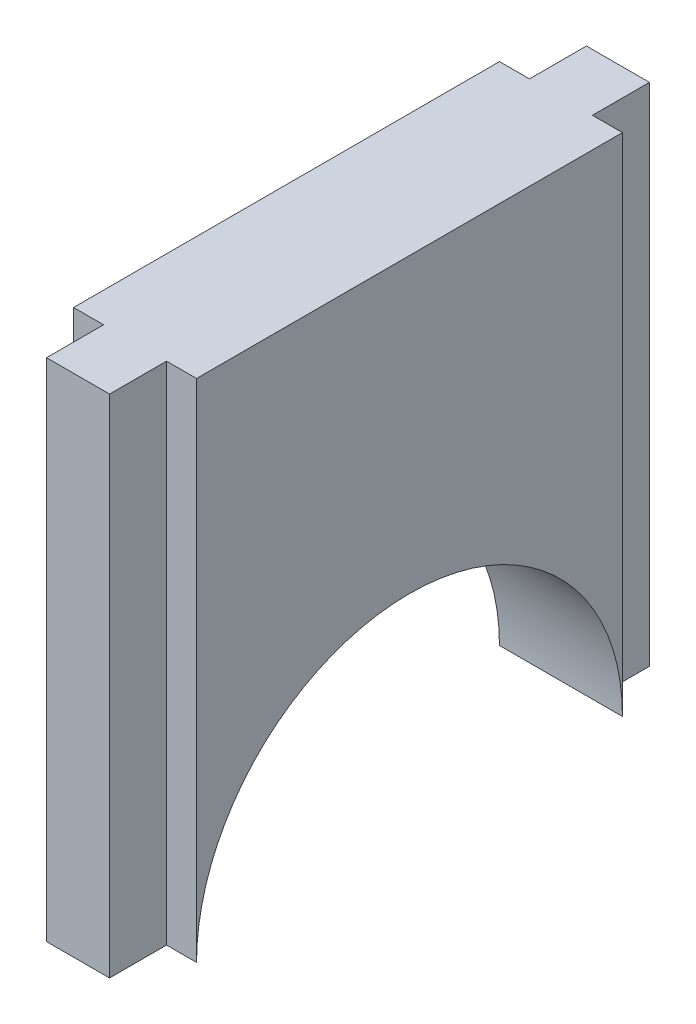
ISO-10303-21;
HEADER;
FILE_DESCRIPTION(('STEP AP214'),'2;1');
FILE_NAME('part.step','',(''),(''),'','','');
FILE_SCHEMA(('AUTOMOTIVE_DESIGN { 1 0 10303 214 1 1 1 1 }'));
ENDSEC;
DATA;
#1=APPLICATION_CONTEXT('core data for automotive mechanical design processes');
#2=APPLICATION_PROTOCOL_DEFINITION('international standard','automotive_design',2000,#1);
#3=PRODUCT_CONTEXT('',#1,'mechanical');
#4=PRODUCT('Part','Part','',(#3));
#5=PRODUCT_RELATED_PRODUCT_CATEGORY('part','',(#4));
#6=PRODUCT_DEFINITION_FORMATION('','',#4);
#7=PRODUCT_DEFINITION_CONTEXT('part definition',#1,'design');
#8=PRODUCT_DEFINITION('design','',#6,#7);
#9=PRODUCT_DEFINITION_SHAPE('','',#8);
#10=(LENGTH_UNIT() NAMED_UNIT(*) SI_UNIT(.MILLI.,.METRE.));
#11=(NAMED_UNIT(*) PLANE_ANGLE_UNIT() SI_UNIT($,.RADIAN.));
#12=(NAMED_UNIT(*) SI_UNIT($,.STERADIAN.) SOLID_ANGLE_UNIT());
#13=UNCERTAINTY_MEASURE_WITH_UNIT(LENGTH_MEASURE(1.E-05),#10,'distance_accuracy_value','');
#14=(GEOMETRIC_REPRESENTATION_CONTEXT(3) GLOBAL_UNCERTAINTY_ASSIGNED_CONTEXT((#13)) GLOBAL_UNIT_ASSIGNED_CONTEXT((#10,
#11,#12)) REPRESENTATION_CONTEXT('',''));
#15=CARTESIAN_POINT('',(0.,0.,0.));
#16=DIRECTION('',(0.,0.,1.));
#17=DIRECTION('',(1.,0.,0.));
#18=AXIS2_PLACEMENT_3D('',#15,#16,#17);
#19=CARTESIAN_POINT('',(-28.65,-16.8599999999996,-19.5999999999987));
#20=DIRECTION('',(0.,0.,1.));
#21=DIRECTION('',(1.,0.,0.));
#22=AXIS2_PLACEMENT_3D('',#19,#20,#21);
#23=PLANE('',#22);
#24=DIRECTION('',(-1.,0.,0.));
#25=VECTOR('',#24,1.);
#26=CARTESIAN_POINT('',(-28.65,0.,-19.5999999999987));
#27=LINE('',#26,#25);
#28=CARTESIAN_POINT('',(-31.75,0.,-19.5999999999987));
#29=VERTEX_POINT('',#28);
#30=CARTESIAN_POINT('',(-32.75,0.,-19.5999999999987));
#31=VERTEX_POINT('',#30);
#32=EDGE_CURVE('E197',#29,#31,#27,.T.);
#33=ORIENTED_EDGE('',*,*,#32,.F.);
#34=DIRECTION('',(0.,1.,0.));
#35=VECTOR('',#34,1.);
#36=CARTESIAN_POINT('',(-31.75,-16.8599999999996,-19.5999999999987));
#37=LINE('',#36,#35);
#38=CARTESIAN_POINT('',(-31.75,-16.8599999999996,-19.5999999999987));
#39=VERTEX_POINT('',#38);
#40=EDGE_CURVE('E187',#39,#29,#37,.T.);
#41=ORIENTED_EDGE('',*,*,#40,.F.);
#42=DIRECTION('',(-1.,0.,0.));
#43=VECTOR('',#42,1.);
#44=CARTESIAN_POINT('',(-28.65,-16.8599999999996,-19.5999999999987));
#45=LINE('',#44,#43);
#46=CARTESIAN_POINT('',(-32.75,-16.8599999999996,-19.5999999999987));
#47=VERTEX_POINT('',#46);
#48=EDGE_CURVE('E195',#39,#47,#45,.T.);
#49=ORIENTED_EDGE('',*,*,#48,.T.);
#50=DIRECTION('',(0.,1.,0.));
#51=VECTOR('',#50,1.);
#52=CARTESIAN_POINT('',(-32.75,-16.8599999999996,-19.5999999999987));
#53=LINE('',#52,#51);
#54=EDGE_CURVE('E208',#47,#31,#53,.T.);
#55=ORIENTED_EDGE('',*,*,#54,.T.);
#56=EDGE_LOOP('',(#33,#41,#49,#55));
#57=FACE_BOUND('',#56,.T.);
#58=ADVANCED_FACE('F78',(#57),#23,.F.);
#59=CARTESIAN_POINT('',(-28.65,0.,-5.39999999999866));
#60=DIRECTION('',(0.,0.,-1.));
#61=DIRECTION('',(0.,1.,0.));
#62=AXIS2_PLACEMENT_3D('',#59,#60,#61);
#63=PLANE('',#62);
#64=DIRECTION('',(-1.,0.,0.));
#65=VECTOR('',#64,1.);
#66=CARTESIAN_POINT('',(-28.65,-16.8599999999996,-5.39999999999866));
#67=LINE('',#66,#65);
#68=CARTESIAN_POINT('',(-31.75,-16.8599999999996,-5.39999999999866));
#69=VERTEX_POINT('',#68);
#70=CARTESIAN_POINT('',(-32.75,-16.8599999999996,-5.39999999999866));
#71=VERTEX_POINT('',#70);
#72=EDGE_CURVE('E228',#69,#71,#67,.T.);
#73=ORIENTED_EDGE('',*,*,#72,.F.);
#74=DIRECTION('',(0.,1.,0.));
#75=VECTOR('',#74,1.);
#76=CARTESIAN_POINT('',(-31.75,-16.8599999999996,-5.39999999999866));
#77=LINE('',#76,#75);
#78=CARTESIAN_POINT('',(-31.75,0.,-5.39999999999866));
#79=VERTEX_POINT('',#78);
#80=EDGE_CURVE('E284',#69,#79,#77,.T.);
#81=ORIENTED_EDGE('',*,*,#80,.T.);
#82=DIRECTION('',(-1.,0.,0.));
#83=VECTOR('',#82,1.);
#84=CARTESIAN_POINT('',(-28.65,0.,-5.39999999999866));
#85=LINE('',#84,#83);
#86=CARTESIAN_POINT('',(-32.75,0.,-5.39999999999866));
#87=VERTEX_POINT('',#86);
#88=EDGE_CURVE('E88',#79,#87,#85,.T.);
#89=ORIENTED_EDGE('',*,*,#88,.T.);
#90=DIRECTION('',(0.,-1.,0.));
#91=VECTOR('',#90,1.);
#92=CARTESIAN_POINT('',(-32.75,0.,-5.39999999999866));
#93=LINE('',#92,#91);
#94=EDGE_CURVE('E213',#87,#71,#93,.T.);
#95=ORIENTED_EDGE('',*,*,#94,.T.);
#96=EDGE_LOOP('',(#73,#81,#89,#95));
#97=FACE_BOUND('',#96,.T.);
#98=ADVANCED_FACE('F346',(#97),#63,.F.);
#99=CARTESIAN_POINT('',(-30.950012,-16.8599999999996,-12.4999999999987));
#100=DIRECTION('',(1.,0.,0.));
#101=DIRECTION('',(0.,0.,-1.));
#102=AXIS2_PLACEMENT_3D('',#99,#100,#101);
#103=CYLINDRICAL_SURFACE('',#102,7.1);
#104=CARTESIAN_POINT('',(-28.65,-16.8599999999996,-5.39999999999866));
#105=VERTEX_POINT('',#104);
#106=CARTESIAN_POINT('',(-29.65,-16.8599999999996,-5.39999999999866));
#107=VERTEX_POINT('',#106);
#108=EDGE_CURVE('E224',#105,#107,#67,.T.);
#109=ORIENTED_EDGE('',*,*,#108,.T.);
#110=DIRECTION('',(-1.,0.,0.));
#111=VECTOR('',#110,1.);
#112=CARTESIAN_POINT('',(-31.75,-16.8599999999996,-5.39999999999866));
#113=LINE('',#112,#111);
#114=EDGE_CURVE('E297',#107,#69,#113,.T.);
#115=ORIENTED_EDGE('',*,*,#114,.T.);
#116=ORIENTED_EDGE('',*,*,#72,.T.);
#117=CARTESIAN_POINT('',(-32.75,-16.8599999999996,-12.4999999999987));
#118=DIRECTION('',(1.,0.,0.));
#119=DIRECTION('',(0.,0.,1.));
#120=AXIS2_PLACEMENT_3D('',#117,#118,#119);
#121=CIRCLE('',#120,7.1);
#122=EDGE_CURVE('E205',#47,#71,#121,.T.);
#123=ORIENTED_EDGE('',*,*,#122,.F.);
#124=ORIENTED_EDGE('',*,*,#48,.F.);
#125=DIRECTION('',(1.,0.,0.));
#126=VECTOR('',#125,1.);
#127=CARTESIAN_POINT('',(-31.75,-16.8599999999996,-19.5999999999987));
#128=LINE('',#127,#126);
#129=CARTESIAN_POINT('',(-29.65,-16.8599999999996,-19.5999999999987));
#130=VERTEX_POINT('',#129);
#131=EDGE_CURVE('E170',#39,#130,#128,.T.);
#132=ORIENTED_EDGE('',*,*,#131,.T.);
#133=CARTESIAN_POINT('',(-28.65,-16.8599999999996,-19.5999999999987));
#134=VERTEX_POINT('',#133);
#135=EDGE_CURVE('E207',#134,#130,#45,.T.);
#136=ORIENTED_EDGE('',*,*,#135,.F.);
#137=CARTESIAN_POINT('',(-28.65,-16.8599999999996,-12.4999999999987));
#138=DIRECTION('',(1.,0.,0.));
#139=DIRECTION('',(0.,1.,0.));
#140=AXIS2_PLACEMENT_3D('',#137,#138,#139);
#141=CIRCLE('',#140,7.1);
#142=EDGE_CURVE('E227',#134,#105,#141,.T.);
#143=ORIENTED_EDGE('',*,*,#142,.T.);
#144=EDGE_LOOP('',(#109,#115,#116,#123,#124,#132,#136,#143));
#145=FACE_BOUND('',#144,.T.);
#146=ADVANCED_FACE('F80',(#145),#103,.F.);
#147=CARTESIAN_POINT('',(-28.65,0.,0.));
#148=DIRECTION('',(1.,0.,0.));
#149=DIRECTION('',(0.,1.,0.));
#150=AXIS2_PLACEMENT_3D('',#147,#148,#149);
#151=PLANE('',#150);
#152=DIRECTION('',(0.,-1.,0.));
#153=VECTOR('',#152,1.);
#154=CARTESIAN_POINT('',(-28.65,0.,-5.39999999999866));
#155=LINE('',#154,#153);
#156=CARTESIAN_POINT('',(-28.65,0.,-5.39999999999866));
#157=VERTEX_POINT('',#156);
#158=EDGE_CURVE('E231',#157,#105,#155,.T.);
#159=ORIENTED_EDGE('',*,*,#158,.T.);
#160=ORIENTED_EDGE('',*,*,#142,.F.);
#161=DIRECTION('',(0.,1.,0.));
#162=VECTOR('',#161,1.);
#163=CARTESIAN_POINT('',(-28.65,-16.8599999999996,-19.5999999999987));
#164=LINE('',#163,#162);
#165=CARTESIAN_POINT('',(-28.65,0.,-19.5999999999987));
#166=VERTEX_POINT('',#165);
#167=EDGE_CURVE('E82',#134,#166,#164,.T.);
#168=ORIENTED_EDGE('',*,*,#167,.T.);
#169=DIRECTION('',(0.,0.,1.));
#170=VECTOR('',#169,1.);
#171=CARTESIAN_POINT('',(-28.65,0.,0.));
#172=LINE('',#171,#170);
#173=EDGE_CURVE('E241',#166,#157,#172,.T.);
#174=ORIENTED_EDGE('',*,*,#173,.T.);
#175=EDGE_LOOP('',(#159,#160,#168,#174));
#176=FACE_BOUND('',#175,.T.);
#177=ADVANCED_FACE('F339',(#176),#151,.T.);
#178=CARTESIAN_POINT('',(-32.75,-16.8599999999996,-12.4999999999987));
#179=DIRECTION('',(-1.,0.,0.));
#180=DIRECTION('',(0.,0.,1.));
#181=AXIS2_PLACEMENT_3D('',#178,#179,#180);
#182=PLANE('',#181);
#183=ORIENTED_EDGE('',*,*,#94,.F.);
#184=DIRECTION('',(0.,0.,-1.));
#185=VECTOR('',#184,1.);
#186=CARTESIAN_POINT('',(-32.75,0.,-12.4999999999987));
#187=LINE('',#186,#185);
#188=EDGE_CURVE('E219',#87,#31,#187,.T.);
#189=ORIENTED_EDGE('',*,*,#188,.T.);
#190=ORIENTED_EDGE('',*,*,#54,.F.);
#191=ORIENTED_EDGE('',*,*,#122,.T.);
#192=EDGE_LOOP('',(#183,#189,#190,#191));
#193=FACE_BOUND('',#192,.T.);
#194=ADVANCED_FACE('F260',(#193),#182,.T.);
#195=CARTESIAN_POINT('',(0.,0.,0.));
#196=DIRECTION('',(0.,1.,0.));
#197=DIRECTION('',(0.,0.,1.));
#198=AXIS2_PLACEMENT_3D('',#195,#196,#197);
#199=PLANE('',#198);
#200=CARTESIAN_POINT('',(-29.65,0.,-5.39999999999866));
#201=VERTEX_POINT('',#200);
#202=EDGE_CURVE('E12',#157,#201,#85,.T.);
#203=ORIENTED_EDGE('',*,*,#202,.F.);
#204=ORIENTED_EDGE('',*,*,#173,.F.);
#205=CARTESIAN_POINT('',(-29.65,0.,-19.5999999999987));
#206=VERTEX_POINT('',#205);
#207=EDGE_CURVE('E215',#166,#206,#27,.T.);
#208=ORIENTED_EDGE('',*,*,#207,.T.);
#209=DIRECTION('',(0.,0.,-1.));
#210=VECTOR('',#209,1.);
#211=CARTESIAN_POINT('',(-29.65,0.,-19.5999999999987));
#212=LINE('',#211,#210);
#213=CARTESIAN_POINT('',(-29.65,0.,-21.4999999999987));
#214=VERTEX_POINT('',#213);
#215=EDGE_CURVE('E275',#206,#214,#212,.T.);
#216=ORIENTED_EDGE('',*,*,#215,.T.);
#217=DIRECTION('',(-1.,0.,0.));
#218=VECTOR('',#217,1.);
#219=CARTESIAN_POINT('',(-31.75,0.,-21.4999999999987));
#220=LINE('',#219,#218);
#221=CARTESIAN_POINT('',(-31.75,0.,-21.4999999999987));
#222=VERTEX_POINT('',#221);
#223=EDGE_CURVE('E191',#214,#222,#220,.T.);
#224=ORIENTED_EDGE('',*,*,#223,.T.);
#225=DIRECTION('',(0.,0.,1.));
#226=VECTOR('',#225,1.);
#227=CARTESIAN_POINT('',(-31.75,0.,-19.5999999999987));
#228=LINE('',#227,#226);
#229=EDGE_CURVE('E96',#222,#29,#228,.T.);
#230=ORIENTED_EDGE('',*,*,#229,.T.);
#231=ORIENTED_EDGE('',*,*,#32,.T.);
#232=ORIENTED_EDGE('',*,*,#188,.F.);
#233=ORIENTED_EDGE('',*,*,#88,.F.);
#234=DIRECTION('',(0.,0.,1.));
#235=VECTOR('',#234,1.);
#236=CARTESIAN_POINT('',(-31.75,0.,-5.39999999999866));
#237=LINE('',#236,#235);
#238=CARTESIAN_POINT('',(-31.75,0.,-3.49999999999866));
#239=VERTEX_POINT('',#238);
#240=EDGE_CURVE('E276',#79,#239,#237,.T.);
#241=ORIENTED_EDGE('',*,*,#240,.T.);
#242=DIRECTION('',(1.,0.,0.));
#243=VECTOR('',#242,1.);
#244=CARTESIAN_POINT('',(-31.75,0.,-3.49999999999866));
#245=LINE('',#244,#243);
#246=CARTESIAN_POINT('',(-29.65,0.,-3.49999999999866));
#247=VERTEX_POINT('',#246);
#248=EDGE_CURVE('E279',#239,#247,#245,.T.);
#249=ORIENTED_EDGE('',*,*,#248,.T.);
#250=DIRECTION('',(0.,0.,-1.));
#251=VECTOR('',#250,1.);
#252=CARTESIAN_POINT('',(-29.65,0.,-5.39999999999866));
#253=LINE('',#252,#251);
#254=EDGE_CURVE('E281',#247,#201,#253,.T.);
#255=ORIENTED_EDGE('',*,*,#254,.T.);
#256=EDGE_LOOP('',(#203,#204,#208,#216,#224,#230,#231,#232,#233,#241,#249,#255));
#257=FACE_BOUND('',#256,.T.);
#258=ADVANCED_FACE('F261',(#257),#199,.T.);
#259=ORIENTED_EDGE('',*,*,#135,.T.);
#260=DIRECTION('',(0.,1.,0.));
#261=VECTOR('',#260,1.);
#262=CARTESIAN_POINT('',(-29.65,-16.8599999999996,-19.5999999999987));
#263=LINE('',#262,#261);
#264=EDGE_CURVE('E199',#130,#206,#263,.T.);
#265=ORIENTED_EDGE('',*,*,#264,.T.);
#266=ORIENTED_EDGE('',*,*,#207,.F.);
#267=ORIENTED_EDGE('',*,*,#167,.F.);
#268=EDGE_LOOP('',(#259,#265,#266,#267));
#269=FACE_BOUND('',#268,.T.);
#270=ADVANCED_FACE('F338',(#269),#23,.F.);
#271=ORIENTED_EDGE('',*,*,#202,.T.);
#272=DIRECTION('',(0.,1.,0.));
#273=VECTOR('',#272,1.);
#274=CARTESIAN_POINT('',(-29.65,-16.8599999999996,-5.39999999999866));
#275=LINE('',#274,#273);
#276=EDGE_CURVE('E285',#107,#201,#275,.T.);
#277=ORIENTED_EDGE('',*,*,#276,.F.);
#278=ORIENTED_EDGE('',*,*,#108,.F.);
#279=ORIENTED_EDGE('',*,*,#158,.F.);
#280=EDGE_LOOP('',(#271,#277,#278,#279));
#281=FACE_BOUND('',#280,.T.);
#282=ADVANCED_FACE('F352',(#281),#63,.F.);
#283=CARTESIAN_POINT('',(-31.75,-16.8599999999996,-5.39999999999866));
#284=DIRECTION('',(-1.,0.,0.));
#285=DIRECTION('',(0.,0.,1.));
#286=AXIS2_PLACEMENT_3D('',#283,#284,#285);
#287=PLANE('',#286);
#288=ORIENTED_EDGE('',*,*,#240,.F.);
#289=ORIENTED_EDGE('',*,*,#80,.F.);
#290=DIRECTION('',(0.,0.,1.));
#291=VECTOR('',#290,1.);
#292=CARTESIAN_POINT('',(-31.75,-16.8599999999996,-5.39999999999866));
#293=LINE('',#292,#291);
#294=CARTESIAN_POINT('',(-31.75,-16.8599999999996,-3.49999999999866));
#295=VERTEX_POINT('',#294);
#296=EDGE_CURVE('E247',#69,#295,#293,.T.);
#297=ORIENTED_EDGE('',*,*,#296,.T.);
#298=DIRECTION('',(0.,1.,0.));
#299=VECTOR('',#298,1.);
#300=CARTESIAN_POINT('',(-31.75,-16.8599999999996,-3.49999999999866));
#301=LINE('',#300,#299);
#302=EDGE_CURVE('E300',#295,#239,#301,.T.);
#303=ORIENTED_EDGE('',*,*,#302,.T.);
#304=EDGE_LOOP('',(#288,#289,#297,#303));
#305=FACE_BOUND('',#304,.T.);
#306=ADVANCED_FACE('F315',(#305),#287,.T.);
#307=CARTESIAN_POINT('',(-29.65,-16.8599999999996,-5.39999999999866));
#308=DIRECTION('',(1.,0.,0.));
#309=DIRECTION('',(0.,0.,-1.));
#310=AXIS2_PLACEMENT_3D('',#307,#308,#309);
#311=PLANE('',#310);
#312=ORIENTED_EDGE('',*,*,#254,.F.);
#313=DIRECTION('',(0.,1.,0.));
#314=VECTOR('',#313,1.);
#315=CARTESIAN_POINT('',(-29.65,-16.8599999999996,-3.49999999999866));
#316=LINE('',#315,#314);
#317=CARTESIAN_POINT('',(-29.65,-16.8599999999996,-3.49999999999866));
#318=VERTEX_POINT('',#317);
#319=EDGE_CURVE('E290',#318,#247,#316,.T.);
#320=ORIENTED_EDGE('',*,*,#319,.F.);
#321=DIRECTION('',(0.,0.,-1.));
#322=VECTOR('',#321,1.);
#323=CARTESIAN_POINT('',(-29.65,-16.8599999999996,-5.39999999999866));
#324=LINE('',#323,#322);
#325=EDGE_CURVE('E272',#318,#107,#324,.T.);
#326=ORIENTED_EDGE('',*,*,#325,.T.);
#327=ORIENTED_EDGE('',*,*,#276,.T.);
#328=EDGE_LOOP('',(#312,#320,#326,#327));
#329=FACE_BOUND('',#328,.T.);
#330=ADVANCED_FACE('F308',(#329),#311,.T.);
#331=CARTESIAN_POINT('',(-31.75,-16.8599999999996,-3.49999999999866));
#332=DIRECTION('',(0.,0.,1.));
#333=DIRECTION('',(1.,0.,0.));
#334=AXIS2_PLACEMENT_3D('',#331,#332,#333);
#335=PLANE('',#334);
#336=ORIENTED_EDGE('',*,*,#248,.F.);
#337=ORIENTED_EDGE('',*,*,#302,.F.);
#338=DIRECTION('',(1.,0.,0.));
#339=VECTOR('',#338,1.);
#340=CARTESIAN_POINT('',(-31.75,-16.8599999999996,-3.49999999999866));
#341=LINE('',#340,#339);
#342=EDGE_CURVE('E269',#295,#318,#341,.T.);
#343=ORIENTED_EDGE('',*,*,#342,.T.);
#344=ORIENTED_EDGE('',*,*,#319,.T.);
#345=EDGE_LOOP('',(#336,#337,#343,#344));
#346=FACE_BOUND('',#345,.T.);
#347=ADVANCED_FACE('F318',(#346),#335,.T.);
#348=CARTESIAN_POINT('',(0.,-16.8599999999996,0.));
#349=DIRECTION('',(0.,1.,0.));
#350=DIRECTION('',(0.,0.,1.));
#351=AXIS2_PLACEMENT_3D('',#348,#349,#350);
#352=PLANE('',#351);
#353=ORIENTED_EDGE('',*,*,#296,.F.);
#354=ORIENTED_EDGE('',*,*,#114,.F.);
#355=ORIENTED_EDGE('',*,*,#325,.F.);
#356=ORIENTED_EDGE('',*,*,#342,.F.);
#357=EDGE_LOOP('',(#353,#354,#355,#356));
#358=FACE_BOUND('',#357,.T.);
#359=ADVANCED_FACE('F312',(#358),#352,.F.);
#360=CARTESIAN_POINT('',(-31.75,-16.8599999999996,-19.5999999999987));
#361=DIRECTION('',(-1.,0.,0.));
#362=DIRECTION('',(0.,0.,1.));
#363=AXIS2_PLACEMENT_3D('',#360,#361,#362);
#364=PLANE('',#363);
#365=ORIENTED_EDGE('',*,*,#229,.F.);
#366=DIRECTION('',(0.,1.,0.));
#367=VECTOR('',#366,1.);
#368=CARTESIAN_POINT('',(-31.75,-16.8599999999996,-21.4999999999987));
#369=LINE('',#368,#367);
#370=CARTESIAN_POINT('',(-31.75,-16.8599999999996,-21.4999999999987));
#371=VERTEX_POINT('',#370);
#372=EDGE_CURVE('E189',#371,#222,#369,.T.);
#373=ORIENTED_EDGE('',*,*,#372,.F.);
#374=DIRECTION('',(0.,0.,1.));
#375=VECTOR('',#374,1.);
#376=CARTESIAN_POINT('',(-31.75,-16.8599999999996,-19.5999999999987));
#377=LINE('',#376,#375);
#378=EDGE_CURVE('E174',#371,#39,#377,.T.);
#379=ORIENTED_EDGE('',*,*,#378,.T.);
#380=ORIENTED_EDGE('',*,*,#40,.T.);
#381=EDGE_LOOP('',(#365,#373,#379,#380));
#382=FACE_BOUND('',#381,.T.);
#383=ADVANCED_FACE('F186',(#382),#364,.T.);
#384=CARTESIAN_POINT('',(-31.75,-16.8599999999996,-21.4999999999987));
#385=DIRECTION('',(0.,0.,-1.));
#386=DIRECTION('',(-1.,0.,0.));
#387=AXIS2_PLACEMENT_3D('',#384,#385,#386);
#388=PLANE('',#387);
#389=ORIENTED_EDGE('',*,*,#223,.F.);
#390=DIRECTION('',(0.,1.,0.));
#391=VECTOR('',#390,1.);
#392=CARTESIAN_POINT('',(-29.65,-16.8599999999996,-21.4999999999987));
#393=LINE('',#392,#391);
#394=CARTESIAN_POINT('',(-29.65,-16.8599999999996,-21.4999999999987));
#395=VERTEX_POINT('',#394);
#396=EDGE_CURVE('E267',#395,#214,#393,.T.);
#397=ORIENTED_EDGE('',*,*,#396,.F.);
#398=DIRECTION('',(-1.,0.,0.));
#399=VECTOR('',#398,1.);
#400=CARTESIAN_POINT('',(-31.75,-16.8599999999996,-21.4999999999987));
#401=LINE('',#400,#399);
#402=EDGE_CURVE('E200',#395,#371,#401,.T.);
#403=ORIENTED_EDGE('',*,*,#402,.T.);
#404=ORIENTED_EDGE('',*,*,#372,.T.);
#405=EDGE_LOOP('',(#389,#397,#403,#404));
#406=FACE_BOUND('',#405,.T.);
#407=ADVANCED_FACE('F336',(#406),#388,.T.);
#408=CARTESIAN_POINT('',(-29.65,-16.8599999999996,-19.5999999999987));
#409=DIRECTION('',(1.,0.,0.));
#410=DIRECTION('',(0.,0.,-1.));
#411=AXIS2_PLACEMENT_3D('',#408,#409,#410);
#412=PLANE('',#411);
#413=ORIENTED_EDGE('',*,*,#215,.F.);
#414=ORIENTED_EDGE('',*,*,#264,.F.);
#415=DIRECTION('',(0.,0.,-1.));
#416=VECTOR('',#415,1.);
#417=CARTESIAN_POINT('',(-29.65,-16.8599999999996,-19.5999999999987));
#418=LINE('',#417,#416);
#419=EDGE_CURVE('E177',#130,#395,#418,.T.);
#420=ORIENTED_EDGE('',*,*,#419,.T.);
#421=ORIENTED_EDGE('',*,*,#396,.T.);
#422=EDGE_LOOP('',(#413,#414,#420,#421));
#423=FACE_BOUND('',#422,.T.);
#424=ADVANCED_FACE('F333',(#423),#412,.T.);
#425=CARTESIAN_POINT('',(0.,-16.8599999999996,0.));
#426=DIRECTION('',(0.,-1.,0.));
#427=DIRECTION('',(0.,0.,-1.));
#428=AXIS2_PLACEMENT_3D('',#425,#426,#427);
#429=PLANE('',#428);
#430=ORIENTED_EDGE('',*,*,#378,.F.);
#431=ORIENTED_EDGE('',*,*,#402,.F.);
#432=ORIENTED_EDGE('',*,*,#419,.F.);
#433=ORIENTED_EDGE('',*,*,#131,.F.);
#434=EDGE_LOOP('',(#430,#431,#432,#433));
#435=FACE_BOUND('',#434,.T.);
#436=ADVANCED_FACE('F172',(#435),#429,.T.);
#437=CLOSED_SHELL('',(#58,#98,#146,#177,#194,#258,#270,#282,#306,#330,#347,#359,#383,#407,#424,#436));
#438=MANIFOLD_SOLID_BREP('B2',#437);
#439=ADVANCED_BREP_SHAPE_REPRESENTATION('',(#18,#438),#14);
#440=SHAPE_DEFINITION_REPRESENTATION(#9,#439);
ENDSEC;
END-ISO-10303-21;
